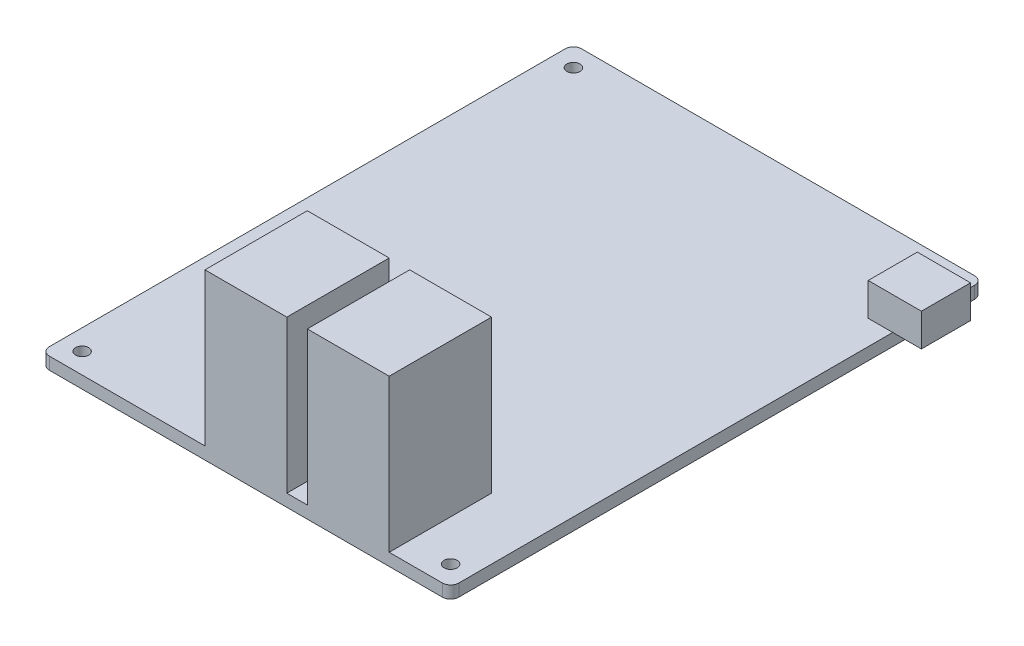
ISO-10303-21;
HEADER;
FILE_DESCRIPTION(('STEP AP214'),'2;1');
FILE_NAME('part.step','',(''),(''),'','','');
FILE_SCHEMA(('AUTOMOTIVE_DESIGN { 1 0 10303 214 1 1 1 1 }'));
ENDSEC;
DATA;
#1=APPLICATION_CONTEXT('core data for automotive mechanical design processes');
#2=APPLICATION_PROTOCOL_DEFINITION('international standard','automotive_design',2000,#1);
#3=PRODUCT_CONTEXT('',#1,'mechanical');
#4=PRODUCT('Part','Part','',(#3));
#5=PRODUCT_RELATED_PRODUCT_CATEGORY('part','',(#4));
#6=PRODUCT_DEFINITION_FORMATION('','',#4);
#7=PRODUCT_DEFINITION_CONTEXT('part definition',#1,'design');
#8=PRODUCT_DEFINITION('design','',#6,#7);
#9=PRODUCT_DEFINITION_SHAPE('','',#8);
#10=(LENGTH_UNIT() NAMED_UNIT(*) SI_UNIT(.MILLI.,.METRE.));
#11=(NAMED_UNIT(*) PLANE_ANGLE_UNIT() SI_UNIT($,.RADIAN.));
#12=(NAMED_UNIT(*) SI_UNIT($,.STERADIAN.) SOLID_ANGLE_UNIT());
#13=UNCERTAINTY_MEASURE_WITH_UNIT(LENGTH_MEASURE(1.E-05),#10,'distance_accuracy_value','');
#14=(GEOMETRIC_REPRESENTATION_CONTEXT(3) GLOBAL_UNCERTAINTY_ASSIGNED_CONTEXT((#13)) GLOBAL_UNIT_ASSIGNED_CONTEXT((#10,
#11,#12)) REPRESENTATION_CONTEXT('',''));
#15=CARTESIAN_POINT('',(0.,0.,0.));
#16=DIRECTION('',(0.,0.,1.));
#17=DIRECTION('',(1.,0.,0.));
#18=AXIS2_PLACEMENT_3D('',#15,#16,#17);
#19=CARTESIAN_POINT('',(0.,3.,0.));
#20=DIRECTION('',(0.,1.,0.));
#21=DIRECTION('',(0.,0.,1.));
#22=AXIS2_PLACEMENT_3D('',#19,#20,#21);
#23=PLANE('',#22);
#24=CARTESIAN_POINT('',(45.,3.,60.));
#25=DIRECTION('',(0.,1.,0.));
#26=DIRECTION('',(0.,0.,-1.));
#27=AXIS2_PLACEMENT_3D('',#24,#25,#26);
#28=CIRCLE('',#27,1.6);
#29=CARTESIAN_POINT('',(45.,3.,58.4));
#30=VERTEX_POINT('',#29);
#31=EDGE_CURVE('E548',#30,#30,#28,.T.);
#32=ORIENTED_EDGE('',*,*,#31,.F.);
#33=EDGE_LOOP('',(#32));
#34=FACE_BOUND('',#33,.T.);
#35=CARTESIAN_POINT('',(45.,3.,-60.));
#36=DIRECTION('',(0.,1.,0.));
#37=DIRECTION('',(0.,0.,1.));
#38=AXIS2_PLACEMENT_3D('',#35,#36,#37);
#39=CIRCLE('',#38,1.6);
#40=CARTESIAN_POINT('',(45.,3.,-58.4));
#41=VERTEX_POINT('',#40);
#42=EDGE_CURVE('E550',#41,#41,#39,.T.);
#43=ORIENTED_EDGE('',*,*,#42,.F.);
#44=EDGE_LOOP('',(#43));
#45=FACE_BOUND('',#44,.T.);
#46=CARTESIAN_POINT('',(-45.,3.,-60.));
#47=DIRECTION('',(0.,1.,0.));
#48=DIRECTION('',(0.,0.,-1.));
#49=AXIS2_PLACEMENT_3D('',#46,#47,#48);
#50=CIRCLE('',#49,1.6);
#51=CARTESIAN_POINT('',(-45.,3.,-61.6));
#52=VERTEX_POINT('',#51);
#53=EDGE_CURVE('E562',#52,#52,#50,.T.);
#54=ORIENTED_EDGE('',*,*,#53,.F.);
#55=EDGE_LOOP('',(#54));
#56=FACE_BOUND('',#55,.T.);
#57=CARTESIAN_POINT('',(-45.,3.,60.));
#58=DIRECTION('',(0.,1.,0.));
#59=DIRECTION('',(0.,0.,1.));
#60=AXIS2_PLACEMENT_3D('',#57,#58,#59);
#61=CIRCLE('',#60,1.6);
#62=CARTESIAN_POINT('',(-45.,3.,61.6));
#63=VERTEX_POINT('',#62);
#64=EDGE_CURVE('E556',#63,#63,#61,.T.);
#65=ORIENTED_EDGE('',*,*,#64,.F.);
#66=EDGE_LOOP('',(#65));
#67=FACE_BOUND('',#66,.T.);
#68=DIRECTION('',(0.,0.,1.));
#69=VECTOR('',#68,1.);
#70=CARTESIAN_POINT('',(44.,3.,-55.));
#71=LINE('',#70,#69);
#72=CARTESIAN_POINT('',(44.,3.,-55.));
#73=VERTEX_POINT('',#72);
#74=CARTESIAN_POINT('',(44.,3.,-43.));
#75=VERTEX_POINT('',#74);
#76=EDGE_CURVE('E50',#73,#75,#71,.T.);
#77=ORIENTED_EDGE('',*,*,#76,.F.);
#78=DIRECTION('',(-1.,0.,0.));
#79=VECTOR('',#78,1.);
#80=CARTESIAN_POINT('',(44.,3.,-55.));
#81=LINE('',#80,#79);
#82=CARTESIAN_POINT('',(50.,3.,-55.));
#83=VERTEX_POINT('',#82);
#84=EDGE_CURVE('E363',#83,#73,#81,.T.);
#85=ORIENTED_EDGE('',*,*,#84,.F.);
#86=DIRECTION('',(0.,0.,-1.));
#87=VECTOR('',#86,1.);
#88=CARTESIAN_POINT('',(50.,3.,65.));
#89=LINE('',#88,#87);
#90=CARTESIAN_POINT('',(50.,3.,-63.));
#91=VERTEX_POINT('',#90);
#92=EDGE_CURVE('E270',#83,#91,#89,.T.);
#93=ORIENTED_EDGE('',*,*,#92,.T.);
#94=CARTESIAN_POINT('',(48.,3.,-63.));
#95=DIRECTION('',(0.,1.,0.));
#96=DIRECTION('',(0.,0.,1.));
#97=AXIS2_PLACEMENT_3D('',#94,#95,#96);
#98=CIRCLE('',#97,2.);
#99=CARTESIAN_POINT('',(48.,3.,-65.));
#100=VERTEX_POINT('',#99);
#101=EDGE_CURVE('E315',#91,#100,#98,.T.);
#102=ORIENTED_EDGE('',*,*,#101,.T.);
#103=DIRECTION('',(1.,0.,0.));
#104=VECTOR('',#103,1.);
#105=CARTESIAN_POINT('',(-50.,3.,-65.));
#106=LINE('',#105,#104);
#107=CARTESIAN_POINT('',(-48.,3.,-65.));
#108=VERTEX_POINT('',#107);
#109=EDGE_CURVE('E275',#108,#100,#106,.T.);
#110=ORIENTED_EDGE('',*,*,#109,.F.);
#111=CARTESIAN_POINT('',(-48.,3.,-63.));
#112=DIRECTION('',(0.,1.,0.));
#113=DIRECTION('',(0.,0.,1.));
#114=AXIS2_PLACEMENT_3D('',#111,#112,#113);
#115=CIRCLE('',#114,2.);
#116=CARTESIAN_POINT('',(-50.,3.,-63.));
#117=VERTEX_POINT('',#116);
#118=EDGE_CURVE('E317',#108,#117,#115,.T.);
#119=ORIENTED_EDGE('',*,*,#118,.T.);
#120=DIRECTION('',(0.,0.,-1.));
#121=VECTOR('',#120,1.);
#122=CARTESIAN_POINT('',(-50.,3.,65.));
#123=LINE('',#122,#121);
#124=CARTESIAN_POINT('',(-50.,3.,63.));
#125=VERTEX_POINT('',#124);
#126=EDGE_CURVE('E279',#125,#117,#123,.T.);
#127=ORIENTED_EDGE('',*,*,#126,.F.);
#128=CARTESIAN_POINT('',(-48.,3.,63.));
#129=DIRECTION('',(0.,1.,0.));
#130=DIRECTION('',(0.,0.,1.));
#131=AXIS2_PLACEMENT_3D('',#128,#129,#130);
#132=CIRCLE('',#131,2.);
#133=CARTESIAN_POINT('',(-48.,3.,65.));
#134=VERTEX_POINT('',#133);
#135=EDGE_CURVE('E311',#125,#134,#132,.T.);
#136=ORIENTED_EDGE('',*,*,#135,.T.);
#137=DIRECTION('',(1.,0.,0.));
#138=VECTOR('',#137,1.);
#139=CARTESIAN_POINT('',(-50.,3.,65.));
#140=LINE('',#139,#138);
#141=CARTESIAN_POINT('',(-9.99999999999999,3.,65.));
#142=VERTEX_POINT('',#141);
#143=EDGE_CURVE('E268',#134,#142,#140,.T.);
#144=ORIENTED_EDGE('',*,*,#143,.T.);
#145=DIRECTION('',(0.,0.,1.));
#146=VECTOR('',#145,1.);
#147=CARTESIAN_POINT('',(-10.,3.,40.));
#148=LINE('',#147,#146);
#149=CARTESIAN_POINT('',(-10.,3.,40.));
#150=VERTEX_POINT('',#149);
#151=EDGE_CURVE('E242',#150,#142,#148,.T.);
#152=ORIENTED_EDGE('',*,*,#151,.F.);
#153=DIRECTION('',(-1.,0.,0.));
#154=VECTOR('',#153,1.);
#155=CARTESIAN_POINT('',(-10.,3.,40.));
#156=LINE('',#155,#154);
#157=CARTESIAN_POINT('',(10.,3.,40.));
#158=VERTEX_POINT('',#157);
#159=EDGE_CURVE('E251',#158,#150,#156,.T.);
#160=ORIENTED_EDGE('',*,*,#159,.F.);
#161=DIRECTION('',(0.,0.,-1.));
#162=VECTOR('',#161,1.);
#163=CARTESIAN_POINT('',(10.,3.,40.));
#164=LINE('',#163,#162);
#165=CARTESIAN_POINT('',(10.,3.,65.));
#166=VERTEX_POINT('',#165);
#167=EDGE_CURVE('E237',#166,#158,#164,.T.);
#168=ORIENTED_EDGE('',*,*,#167,.F.);
#169=CARTESIAN_POINT('',(15.,3.,65.));
#170=VERTEX_POINT('',#169);
#171=EDGE_CURVE('E271',#166,#170,#140,.T.);
#172=ORIENTED_EDGE('',*,*,#171,.T.);
#173=DIRECTION('',(0.,0.,1.));
#174=VECTOR('',#173,1.);
#175=CARTESIAN_POINT('',(15.,3.,40.));
#176=LINE('',#175,#174);
#177=CARTESIAN_POINT('',(15.,3.,40.));
#178=VERTEX_POINT('',#177);
#179=EDGE_CURVE('E215',#178,#170,#176,.T.);
#180=ORIENTED_EDGE('',*,*,#179,.F.);
#181=DIRECTION('',(-1.,0.,0.));
#182=VECTOR('',#181,1.);
#183=CARTESIAN_POINT('',(15.,3.,40.));
#184=LINE('',#183,#182);
#185=CARTESIAN_POINT('',(35.,3.,40.));
#186=VERTEX_POINT('',#185);
#187=EDGE_CURVE('E205',#186,#178,#184,.T.);
#188=ORIENTED_EDGE('',*,*,#187,.F.);
#189=DIRECTION('',(0.,0.,-1.));
#190=VECTOR('',#189,1.);
#191=CARTESIAN_POINT('',(35.,3.,40.));
#192=LINE('',#191,#190);
#193=CARTESIAN_POINT('',(35.,3.,65.));
#194=VERTEX_POINT('',#193);
#195=EDGE_CURVE('E202',#194,#186,#192,.T.);
#196=ORIENTED_EDGE('',*,*,#195,.F.);
#197=CARTESIAN_POINT('',(48.,3.,65.));
#198=VERTEX_POINT('',#197);
#199=EDGE_CURVE('E272',#194,#198,#140,.T.);
#200=ORIENTED_EDGE('',*,*,#199,.T.);
#201=CARTESIAN_POINT('',(48.,3.,63.));
#202=DIRECTION('',(0.,1.,0.));
#203=DIRECTION('',(0.,0.,1.));
#204=AXIS2_PLACEMENT_3D('',#201,#202,#203);
#205=CIRCLE('',#204,2.);
#206=CARTESIAN_POINT('',(50.,3.,63.));
#207=VERTEX_POINT('',#206);
#208=EDGE_CURVE('E313',#198,#207,#205,.T.);
#209=ORIENTED_EDGE('',*,*,#208,.T.);
#210=CARTESIAN_POINT('',(50.,3.,-43.));
#211=VERTEX_POINT('',#210);
#212=EDGE_CURVE('E273',#207,#211,#89,.T.);
#213=ORIENTED_EDGE('',*,*,#212,.T.);
#214=DIRECTION('',(1.,0.,0.));
#215=VECTOR('',#214,1.);
#216=CARTESIAN_POINT('',(44.,3.,-43.));
#217=LINE('',#216,#215);
#218=EDGE_CURVE('E55',#75,#211,#217,.T.);
#219=ORIENTED_EDGE('',*,*,#218,.F.);
#220=EDGE_LOOP('',(#77,#85,#93,#102,#110,#119,#127,#136,#144,#152,#160,#168,#172,#180,#188,#196,
#200,#209,#213,#219));
#221=FACE_BOUND('',#220,.T.);
#222=ADVANCED_FACE('F35',(#34,#45,#56,#67,#221),#23,.T.);
#223=CARTESIAN_POINT('',(-50.,3.,65.));
#224=DIRECTION('',(0.,0.,-1.));
#225=DIRECTION('',(-1.,0.,0.));
#226=AXIS2_PLACEMENT_3D('',#223,#224,#225);
#227=PLANE('',#226);
#228=DIRECTION('',(1.,0.,0.));
#229=VECTOR('',#228,1.);
#230=CARTESIAN_POINT('',(-50.,0.,65.));
#231=LINE('',#230,#229);
#232=CARTESIAN_POINT('',(-48.,0.,65.));
#233=VERTEX_POINT('',#232);
#234=CARTESIAN_POINT('',(48.,0.,65.));
#235=VERTEX_POINT('',#234);
#236=EDGE_CURVE('E267',#233,#235,#231,.T.);
#237=ORIENTED_EDGE('',*,*,#236,.T.);
#238=DIRECTION('',(0.,-1.,0.));
#239=VECTOR('',#238,1.);
#240=CARTESIAN_POINT('',(48.,3.,65.));
#241=LINE('',#240,#239);
#242=EDGE_CURVE('E11',#235,#198,#241,.F.);
#243=ORIENTED_EDGE('',*,*,#242,.T.);
#244=ORIENTED_EDGE('',*,*,#199,.F.);
#245=DIRECTION('',(0.,-1.,0.));
#246=VECTOR('',#245,1.);
#247=CARTESIAN_POINT('',(35.,40.25,65.));
#248=LINE('',#247,#246);
#249=CARTESIAN_POINT('',(35.,40.25,65.));
#250=VERTEX_POINT('',#249);
#251=EDGE_CURVE('E220',#250,#194,#248,.T.);
#252=ORIENTED_EDGE('',*,*,#251,.F.);
#253=DIRECTION('',(1.,0.,0.));
#254=VECTOR('',#253,1.);
#255=CARTESIAN_POINT('',(15.,40.25,65.));
#256=LINE('',#255,#254);
#257=CARTESIAN_POINT('',(15.,40.25,65.));
#258=VERTEX_POINT('',#257);
#259=EDGE_CURVE('E219',#258,#250,#256,.T.);
#260=ORIENTED_EDGE('',*,*,#259,.F.);
#261=DIRECTION('',(0.,-1.,0.));
#262=VECTOR('',#261,1.);
#263=CARTESIAN_POINT('',(15.,40.25,65.));
#264=LINE('',#263,#262);
#265=EDGE_CURVE('E228',#258,#170,#264,.T.);
#266=ORIENTED_EDGE('',*,*,#265,.T.);
#267=ORIENTED_EDGE('',*,*,#171,.F.);
#268=DIRECTION('',(0.,-1.,0.));
#269=VECTOR('',#268,1.);
#270=CARTESIAN_POINT('',(10.,40.25,65.));
#271=LINE('',#270,#269);
#272=CARTESIAN_POINT('',(10.,40.25,65.));
#273=VERTEX_POINT('',#272);
#274=EDGE_CURVE('E248',#273,#166,#271,.T.);
#275=ORIENTED_EDGE('',*,*,#274,.F.);
#276=DIRECTION('',(1.,0.,0.));
#277=VECTOR('',#276,1.);
#278=CARTESIAN_POINT('',(-10.,40.25,65.));
#279=LINE('',#278,#277);
#280=CARTESIAN_POINT('',(-10.,40.25,65.));
#281=VERTEX_POINT('',#280);
#282=EDGE_CURVE('E246',#281,#273,#279,.T.);
#283=ORIENTED_EDGE('',*,*,#282,.F.);
#284=DIRECTION('',(0.,-1.,0.));
#285=VECTOR('',#284,1.);
#286=CARTESIAN_POINT('',(-10.,40.25,65.));
#287=LINE('',#286,#285);
#288=EDGE_CURVE('E258',#281,#142,#287,.T.);
#289=ORIENTED_EDGE('',*,*,#288,.T.);
#290=ORIENTED_EDGE('',*,*,#143,.F.);
#291=DIRECTION('',(0.,-1.,0.));
#292=VECTOR('',#291,1.);
#293=CARTESIAN_POINT('',(-48.,0.,65.));
#294=LINE('',#293,#292);
#295=EDGE_CURVE('E43',#134,#233,#294,.T.);
#296=ORIENTED_EDGE('',*,*,#295,.T.);
#297=EDGE_LOOP('',(#237,#243,#244,#252,#260,#266,#267,#275,#283,#289,#290,#296));
#298=FACE_BOUND('',#297,.T.);
#299=ADVANCED_FACE('F329',(#298),#227,.F.);
#300=CARTESIAN_POINT('',(50.,3.,65.));
#301=DIRECTION('',(-1.,0.,0.));
#302=DIRECTION('',(0.,0.,1.));
#303=AXIS2_PLACEMENT_3D('',#300,#301,#302);
#304=PLANE('',#303);
#305=DIRECTION('',(0.,0.,-1.));
#306=VECTOR('',#305,1.);
#307=CARTESIAN_POINT('',(50.,0.,65.));
#308=LINE('',#307,#306);
#309=CARTESIAN_POINT('',(50.,0.,63.));
#310=VERTEX_POINT('',#309);
#311=CARTESIAN_POINT('',(50.,0.,-63.));
#312=VERTEX_POINT('',#311);
#313=EDGE_CURVE('E285',#310,#312,#308,.T.);
#314=ORIENTED_EDGE('',*,*,#313,.T.);
#315=DIRECTION('',(0.,-1.,0.));
#316=VECTOR('',#315,1.);
#317=CARTESIAN_POINT('',(50.,3.,-63.));
#318=LINE('',#317,#316);
#319=EDGE_CURVE('E322',#312,#91,#318,.F.);
#320=ORIENTED_EDGE('',*,*,#319,.T.);
#321=ORIENTED_EDGE('',*,*,#92,.F.);
#322=EDGE_CURVE('E276',#211,#83,#89,.T.);
#323=ORIENTED_EDGE('',*,*,#322,.F.);
#324=ORIENTED_EDGE('',*,*,#212,.F.);
#325=DIRECTION('',(0.,-1.,0.));
#326=VECTOR('',#325,1.);
#327=CARTESIAN_POINT('',(50.,3.,63.));
#328=LINE('',#327,#326);
#329=EDGE_CURVE('E319',#207,#310,#328,.T.);
#330=ORIENTED_EDGE('',*,*,#329,.T.);
#331=EDGE_LOOP('',(#314,#320,#321,#323,#324,#330));
#332=FACE_BOUND('',#331,.T.);
#333=ADVANCED_FACE('F343',(#332),#304,.F.);
#334=CARTESIAN_POINT('',(-50.,3.,-65.));
#335=DIRECTION('',(0.,0.,-1.));
#336=DIRECTION('',(-1.,0.,0.));
#337=AXIS2_PLACEMENT_3D('',#334,#335,#336);
#338=PLANE('',#337);
#339=DIRECTION('',(1.,0.,0.));
#340=VECTOR('',#339,1.);
#341=CARTESIAN_POINT('',(-50.,0.,-65.));
#342=LINE('',#341,#340);
#343=CARTESIAN_POINT('',(-48.,0.,-65.));
#344=VERTEX_POINT('',#343);
#345=CARTESIAN_POINT('',(48.,0.,-65.));
#346=VERTEX_POINT('',#345);
#347=EDGE_CURVE('E288',#344,#346,#342,.T.);
#348=ORIENTED_EDGE('',*,*,#347,.F.);
#349=DIRECTION('',(0.,-1.,0.));
#350=VECTOR('',#349,1.);
#351=CARTESIAN_POINT('',(-48.,3.,-65.));
#352=LINE('',#351,#350);
#353=EDGE_CURVE('E309',#344,#108,#352,.F.);
#354=ORIENTED_EDGE('',*,*,#353,.T.);
#355=ORIENTED_EDGE('',*,*,#109,.T.);
#356=DIRECTION('',(0.,-1.,0.));
#357=VECTOR('',#356,1.);
#358=CARTESIAN_POINT('',(48.,0.,-65.));
#359=LINE('',#358,#357);
#360=EDGE_CURVE('E306',#100,#346,#359,.T.);
#361=ORIENTED_EDGE('',*,*,#360,.T.);
#362=EDGE_LOOP('',(#348,#354,#355,#361));
#363=FACE_BOUND('',#362,.T.);
#364=ADVANCED_FACE('F396',(#363),#338,.T.);
#365=CARTESIAN_POINT('',(-50.,3.,65.));
#366=DIRECTION('',(-1.,0.,0.));
#367=DIRECTION('',(0.,0.,1.));
#368=AXIS2_PLACEMENT_3D('',#365,#366,#367);
#369=PLANE('',#368);
#370=ORIENTED_EDGE('',*,*,#126,.T.);
#371=DIRECTION('',(0.,-1.,0.));
#372=VECTOR('',#371,1.);
#373=CARTESIAN_POINT('',(-50.,3.,-63.));
#374=LINE('',#373,#372);
#375=CARTESIAN_POINT('',(-50.,0.,-63.));
#376=VERTEX_POINT('',#375);
#377=EDGE_CURVE('E295',#117,#376,#374,.T.);
#378=ORIENTED_EDGE('',*,*,#377,.T.);
#379=DIRECTION('',(0.,0.,-1.));
#380=VECTOR('',#379,1.);
#381=CARTESIAN_POINT('',(-50.,0.,65.));
#382=LINE('',#381,#380);
#383=CARTESIAN_POINT('',(-50.,0.,63.));
#384=VERTEX_POINT('',#383);
#385=EDGE_CURVE('E291',#384,#376,#382,.T.);
#386=ORIENTED_EDGE('',*,*,#385,.F.);
#387=DIRECTION('',(0.,-1.,0.));
#388=VECTOR('',#387,1.);
#389=CARTESIAN_POINT('',(-50.,3.,63.));
#390=LINE('',#389,#388);
#391=EDGE_CURVE('E282',#384,#125,#390,.F.);
#392=ORIENTED_EDGE('',*,*,#391,.T.);
#393=EDGE_LOOP('',(#370,#378,#386,#392));
#394=FACE_BOUND('',#393,.T.);
#395=ADVANCED_FACE('F392',(#394),#369,.T.);
#396=CARTESIAN_POINT('',(0.,0.,0.));
#397=DIRECTION('',(0.,1.,0.));
#398=DIRECTION('',(0.,0.,1.));
#399=AXIS2_PLACEMENT_3D('',#396,#397,#398);
#400=PLANE('',#399);
#401=CARTESIAN_POINT('',(45.,0.,60.));
#402=DIRECTION('',(0.,1.,0.));
#403=DIRECTION('',(0.,0.,-1.));
#404=AXIS2_PLACEMENT_3D('',#401,#402,#403);
#405=CIRCLE('',#404,1.6);
#406=CARTESIAN_POINT('',(45.,0.,58.4));
#407=VERTEX_POINT('',#406);
#408=EDGE_CURVE('E546',#407,#407,#405,.T.);
#409=ORIENTED_EDGE('',*,*,#408,.T.);
#410=EDGE_LOOP('',(#409));
#411=FACE_BOUND('',#410,.T.);
#412=CARTESIAN_POINT('',(45.,0.,-60.));
#413=DIRECTION('',(0.,1.,0.));
#414=DIRECTION('',(0.,0.,1.));
#415=AXIS2_PLACEMENT_3D('',#412,#413,#414);
#416=CIRCLE('',#415,1.6);
#417=CARTESIAN_POINT('',(45.,0.,-58.4));
#418=VERTEX_POINT('',#417);
#419=EDGE_CURVE('E567',#418,#418,#416,.T.);
#420=ORIENTED_EDGE('',*,*,#419,.T.);
#421=EDGE_LOOP('',(#420));
#422=FACE_BOUND('',#421,.T.);
#423=CARTESIAN_POINT('',(-45.,0.,-60.));
#424=DIRECTION('',(0.,1.,0.));
#425=DIRECTION('',(0.,0.,-1.));
#426=AXIS2_PLACEMENT_3D('',#423,#424,#425);
#427=CIRCLE('',#426,1.6);
#428=CARTESIAN_POINT('',(-45.,0.,-61.6));
#429=VERTEX_POINT('',#428);
#430=EDGE_CURVE('E558',#429,#429,#427,.T.);
#431=ORIENTED_EDGE('',*,*,#430,.T.);
#432=EDGE_LOOP('',(#431));
#433=FACE_BOUND('',#432,.T.);
#434=CARTESIAN_POINT('',(-45.,0.,60.));
#435=DIRECTION('',(0.,1.,0.));
#436=DIRECTION('',(0.,0.,1.));
#437=AXIS2_PLACEMENT_3D('',#434,#435,#436);
#438=CIRCLE('',#437,1.6);
#439=CARTESIAN_POINT('',(-45.,0.,61.6));
#440=VERTEX_POINT('',#439);
#441=EDGE_CURVE('E364',#440,#440,#438,.T.);
#442=ORIENTED_EDGE('',*,*,#441,.T.);
#443=EDGE_LOOP('',(#442));
#444=FACE_BOUND('',#443,.T.);
#445=ORIENTED_EDGE('',*,*,#385,.T.);
#446=CARTESIAN_POINT('',(-48.,0.,-63.));
#447=DIRECTION('',(0.,1.,0.));
#448=DIRECTION('',(0.,0.,1.));
#449=AXIS2_PLACEMENT_3D('',#446,#447,#448);
#450=CIRCLE('',#449,2.);
#451=EDGE_CURVE('E304',#376,#344,#450,.F.);
#452=ORIENTED_EDGE('',*,*,#451,.T.);
#453=ORIENTED_EDGE('',*,*,#347,.T.);
#454=CARTESIAN_POINT('',(48.,0.,-63.));
#455=DIRECTION('',(0.,1.,0.));
#456=DIRECTION('',(0.,0.,1.));
#457=AXIS2_PLACEMENT_3D('',#454,#455,#456);
#458=CIRCLE('',#457,2.);
#459=EDGE_CURVE('E302',#346,#312,#458,.F.);
#460=ORIENTED_EDGE('',*,*,#459,.T.);
#461=ORIENTED_EDGE('',*,*,#313,.F.);
#462=CARTESIAN_POINT('',(48.,0.,63.));
#463=DIRECTION('',(0.,1.,0.));
#464=DIRECTION('',(0.,0.,1.));
#465=AXIS2_PLACEMENT_3D('',#462,#463,#464);
#466=CIRCLE('',#465,2.);
#467=EDGE_CURVE('E300',#310,#235,#466,.F.);
#468=ORIENTED_EDGE('',*,*,#467,.T.);
#469=ORIENTED_EDGE('',*,*,#236,.F.);
#470=CARTESIAN_POINT('',(-48.,0.,63.));
#471=DIRECTION('',(0.,1.,0.));
#472=DIRECTION('',(0.,0.,1.));
#473=AXIS2_PLACEMENT_3D('',#470,#471,#472);
#474=CIRCLE('',#473,2.);
#475=EDGE_CURVE('E298',#233,#384,#474,.F.);
#476=ORIENTED_EDGE('',*,*,#475,.T.);
#477=EDGE_LOOP('',(#445,#452,#453,#460,#461,#468,#469,#476));
#478=FACE_BOUND('',#477,.T.);
#479=ADVANCED_FACE('F334',(#411,#422,#433,#444,#478),#400,.F.);
#480=CARTESIAN_POINT('',(10.,40.25,40.));
#481=DIRECTION('',(-1.,0.,0.));
#482=DIRECTION('',(0.,0.,1.));
#483=AXIS2_PLACEMENT_3D('',#480,#481,#482);
#484=PLANE('',#483);
#485=ORIENTED_EDGE('',*,*,#167,.T.);
#486=DIRECTION('',(0.,-1.,0.));
#487=VECTOR('',#486,1.);
#488=CARTESIAN_POINT('',(10.,40.25,40.));
#489=LINE('',#488,#487);
#490=CARTESIAN_POINT('',(10.,40.25,40.));
#491=VERTEX_POINT('',#490);
#492=EDGE_CURVE('E264',#491,#158,#489,.T.);
#493=ORIENTED_EDGE('',*,*,#492,.F.);
#494=DIRECTION('',(0.,0.,-1.));
#495=VECTOR('',#494,1.);
#496=CARTESIAN_POINT('',(10.,40.25,40.));
#497=LINE('',#496,#495);
#498=EDGE_CURVE('E238',#273,#491,#497,.T.);
#499=ORIENTED_EDGE('',*,*,#498,.F.);
#500=ORIENTED_EDGE('',*,*,#274,.T.);
#501=EDGE_LOOP('',(#485,#493,#499,#500));
#502=FACE_BOUND('',#501,.T.);
#503=ADVANCED_FACE('F389',(#502),#484,.F.);
#504=CARTESIAN_POINT('',(-10.,40.25,40.));
#505=DIRECTION('',(0.,0.,1.));
#506=DIRECTION('',(1.,0.,0.));
#507=AXIS2_PLACEMENT_3D('',#504,#505,#506);
#508=PLANE('',#507);
#509=ORIENTED_EDGE('',*,*,#159,.T.);
#510=DIRECTION('',(0.,-1.,0.));
#511=VECTOR('',#510,1.);
#512=CARTESIAN_POINT('',(-10.,40.25,40.));
#513=LINE('',#512,#511);
#514=CARTESIAN_POINT('',(-10.,40.25,40.));
#515=VERTEX_POINT('',#514);
#516=EDGE_CURVE('E261',#515,#150,#513,.T.);
#517=ORIENTED_EDGE('',*,*,#516,.F.);
#518=DIRECTION('',(-1.,0.,0.));
#519=VECTOR('',#518,1.);
#520=CARTESIAN_POINT('',(-10.,40.25,40.));
#521=LINE('',#520,#519);
#522=EDGE_CURVE('E241',#491,#515,#521,.T.);
#523=ORIENTED_EDGE('',*,*,#522,.F.);
#524=ORIENTED_EDGE('',*,*,#492,.T.);
#525=EDGE_LOOP('',(#509,#517,#523,#524));
#526=FACE_BOUND('',#525,.T.);
#527=ADVANCED_FACE('F442',(#526),#508,.F.);
#528=CARTESIAN_POINT('',(-10.,40.25,40.));
#529=DIRECTION('',(1.,0.,0.));
#530=DIRECTION('',(0.,0.,-1.));
#531=AXIS2_PLACEMENT_3D('',#528,#529,#530);
#532=PLANE('',#531);
#533=ORIENTED_EDGE('',*,*,#151,.T.);
#534=ORIENTED_EDGE('',*,*,#288,.F.);
#535=DIRECTION('',(0.,0.,1.));
#536=VECTOR('',#535,1.);
#537=CARTESIAN_POINT('',(-10.,40.25,40.));
#538=LINE('',#537,#536);
#539=EDGE_CURVE('E244',#515,#281,#538,.T.);
#540=ORIENTED_EDGE('',*,*,#539,.F.);
#541=ORIENTED_EDGE('',*,*,#516,.T.);
#542=EDGE_LOOP('',(#533,#534,#540,#541));
#543=FACE_BOUND('',#542,.T.);
#544=ADVANCED_FACE('F431',(#543),#532,.F.);
#545=CARTESIAN_POINT('',(0.,40.25,0.));
#546=DIRECTION('',(0.,1.,0.));
#547=DIRECTION('',(0.,0.,1.));
#548=AXIS2_PLACEMENT_3D('',#545,#546,#547);
#549=PLANE('',#548);
#550=ORIENTED_EDGE('',*,*,#498,.T.);
#551=ORIENTED_EDGE('',*,*,#522,.T.);
#552=ORIENTED_EDGE('',*,*,#539,.T.);
#553=ORIENTED_EDGE('',*,*,#282,.T.);
#554=EDGE_LOOP('',(#550,#551,#552,#553));
#555=FACE_BOUND('',#554,.T.);
#556=ADVANCED_FACE('F439',(#555),#549,.T.);
#557=CARTESIAN_POINT('',(35.,40.25,40.));
#558=DIRECTION('',(-1.,0.,0.));
#559=DIRECTION('',(0.,0.,1.));
#560=AXIS2_PLACEMENT_3D('',#557,#558,#559);
#561=PLANE('',#560);
#562=ORIENTED_EDGE('',*,*,#195,.T.);
#563=DIRECTION('',(0.,-1.,0.));
#564=VECTOR('',#563,1.);
#565=CARTESIAN_POINT('',(35.,40.25,40.));
#566=LINE('',#565,#564);
#567=CARTESIAN_POINT('',(35.,40.25,40.));
#568=VERTEX_POINT('',#567);
#569=EDGE_CURVE('E234',#568,#186,#566,.T.);
#570=ORIENTED_EDGE('',*,*,#569,.F.);
#571=DIRECTION('',(0.,0.,-1.));
#572=VECTOR('',#571,1.);
#573=CARTESIAN_POINT('',(35.,40.25,40.));
#574=LINE('',#573,#572);
#575=EDGE_CURVE('E211',#250,#568,#574,.T.);
#576=ORIENTED_EDGE('',*,*,#575,.F.);
#577=ORIENTED_EDGE('',*,*,#251,.T.);
#578=EDGE_LOOP('',(#562,#570,#576,#577));
#579=FACE_BOUND('',#578,.T.);
#580=ADVANCED_FACE('F458',(#579),#561,.F.);
#581=CARTESIAN_POINT('',(15.,40.25,40.));
#582=DIRECTION('',(0.,0.,1.));
#583=DIRECTION('',(1.,0.,0.));
#584=AXIS2_PLACEMENT_3D('',#581,#582,#583);
#585=PLANE('',#584);
#586=ORIENTED_EDGE('',*,*,#187,.T.);
#587=DIRECTION('',(0.,-1.,0.));
#588=VECTOR('',#587,1.);
#589=CARTESIAN_POINT('',(15.,40.25,40.));
#590=LINE('',#589,#588);
#591=CARTESIAN_POINT('',(15.,40.25,40.));
#592=VERTEX_POINT('',#591);
#593=EDGE_CURVE('E231',#592,#178,#590,.T.);
#594=ORIENTED_EDGE('',*,*,#593,.F.);
#595=DIRECTION('',(-1.,0.,0.));
#596=VECTOR('',#595,1.);
#597=CARTESIAN_POINT('',(15.,40.25,40.));
#598=LINE('',#597,#596);
#599=EDGE_CURVE('E214',#568,#592,#598,.T.);
#600=ORIENTED_EDGE('',*,*,#599,.F.);
#601=ORIENTED_EDGE('',*,*,#569,.T.);
#602=EDGE_LOOP('',(#586,#594,#600,#601));
#603=FACE_BOUND('',#602,.T.);
#604=ADVANCED_FACE('F461',(#603),#585,.F.);
#605=CARTESIAN_POINT('',(15.,40.25,40.));
#606=DIRECTION('',(1.,0.,0.));
#607=DIRECTION('',(0.,0.,-1.));
#608=AXIS2_PLACEMENT_3D('',#605,#606,#607);
#609=PLANE('',#608);
#610=ORIENTED_EDGE('',*,*,#179,.T.);
#611=ORIENTED_EDGE('',*,*,#265,.F.);
#612=DIRECTION('',(0.,0.,1.));
#613=VECTOR('',#612,1.);
#614=CARTESIAN_POINT('',(15.,40.25,40.));
#615=LINE('',#614,#613);
#616=EDGE_CURVE('E217',#592,#258,#615,.T.);
#617=ORIENTED_EDGE('',*,*,#616,.F.);
#618=ORIENTED_EDGE('',*,*,#593,.T.);
#619=EDGE_LOOP('',(#610,#611,#617,#618));
#620=FACE_BOUND('',#619,.T.);
#621=ADVANCED_FACE('F465',(#620),#609,.F.);
#622=CARTESIAN_POINT('',(0.,40.25,0.));
#623=DIRECTION('',(0.,1.,0.));
#624=DIRECTION('',(0.,0.,1.));
#625=AXIS2_PLACEMENT_3D('',#622,#623,#624);
#626=PLANE('',#625);
#627=ORIENTED_EDGE('',*,*,#575,.T.);
#628=ORIENTED_EDGE('',*,*,#599,.T.);
#629=ORIENTED_EDGE('',*,*,#616,.T.);
#630=ORIENTED_EDGE('',*,*,#259,.T.);
#631=EDGE_LOOP('',(#627,#628,#629,#630));
#632=FACE_BOUND('',#631,.T.);
#633=ADVANCED_FACE('F407',(#632),#626,.T.);
#634=CARTESIAN_POINT('',(-48.,3.,-63.));
#635=DIRECTION('',(0.,-1.,0.));
#636=DIRECTION('',(0.,0.,-1.));
#637=AXIS2_PLACEMENT_3D('',#634,#635,#636);
#638=CYLINDRICAL_SURFACE('',#637,2.);
#639=ORIENTED_EDGE('',*,*,#118,.F.);
#640=ORIENTED_EDGE('',*,*,#353,.F.);
#641=ORIENTED_EDGE('',*,*,#451,.F.);
#642=ORIENTED_EDGE('',*,*,#377,.F.);
#643=EDGE_LOOP('',(#639,#640,#641,#642));
#644=FACE_BOUND('',#643,.T.);
#645=ADVANCED_FACE('F403',(#644),#638,.T.);
#646=CARTESIAN_POINT('',(48.,3.,-63.));
#647=DIRECTION('',(0.,1.,0.));
#648=DIRECTION('',(0.,0.,1.));
#649=AXIS2_PLACEMENT_3D('',#646,#647,#648);
#650=CYLINDRICAL_SURFACE('',#649,2.);
#651=ORIENTED_EDGE('',*,*,#101,.F.);
#652=ORIENTED_EDGE('',*,*,#319,.F.);
#653=ORIENTED_EDGE('',*,*,#459,.F.);
#654=ORIENTED_EDGE('',*,*,#360,.F.);
#655=EDGE_LOOP('',(#651,#652,#653,#654));
#656=FACE_BOUND('',#655,.T.);
#657=ADVANCED_FACE('F406',(#656),#650,.T.);
#658=CARTESIAN_POINT('',(48.,3.,63.));
#659=DIRECTION('',(0.,-1.,0.));
#660=DIRECTION('',(0.,0.,-1.));
#661=AXIS2_PLACEMENT_3D('',#658,#659,#660);
#662=CYLINDRICAL_SURFACE('',#661,2.);
#663=ORIENTED_EDGE('',*,*,#208,.F.);
#664=ORIENTED_EDGE('',*,*,#242,.F.);
#665=ORIENTED_EDGE('',*,*,#467,.F.);
#666=ORIENTED_EDGE('',*,*,#329,.F.);
#667=EDGE_LOOP('',(#663,#664,#665,#666));
#668=FACE_BOUND('',#667,.T.);
#669=ADVANCED_FACE('F340',(#668),#662,.T.);
#670=CARTESIAN_POINT('',(-48.,3.,63.));
#671=DIRECTION('',(0.,1.,0.));
#672=DIRECTION('',(0.,0.,1.));
#673=AXIS2_PLACEMENT_3D('',#670,#671,#672);
#674=CYLINDRICAL_SURFACE('',#673,2.);
#675=ORIENTED_EDGE('',*,*,#135,.F.);
#676=ORIENTED_EDGE('',*,*,#391,.F.);
#677=ORIENTED_EDGE('',*,*,#475,.F.);
#678=ORIENTED_EDGE('',*,*,#295,.F.);
#679=EDGE_LOOP('',(#675,#676,#677,#678));
#680=FACE_BOUND('',#679,.T.);
#681=ADVANCED_FACE('F37',(#680),#674,.T.);
#682=CARTESIAN_POINT('',(0.,3.,0.));
#683=DIRECTION('',(0.,1.,0.));
#684=DIRECTION('',(0.,0.,1.));
#685=AXIS2_PLACEMENT_3D('',#682,#683,#684);
#686=PLANE('',#685);
#687=CARTESIAN_POINT('',(57.,3.,-43.));
#688=VERTEX_POINT('',#687);
#689=EDGE_CURVE('E349',#211,#688,#217,.T.);
#690=ORIENTED_EDGE('',*,*,#689,.F.);
#691=ORIENTED_EDGE('',*,*,#322,.T.);
#692=CARTESIAN_POINT('',(57.,3.,-55.));
#693=VERTEX_POINT('',#692);
#694=EDGE_CURVE('E365',#693,#83,#81,.T.);
#695=ORIENTED_EDGE('',*,*,#694,.F.);
#696=DIRECTION('',(0.,0.,-1.));
#697=VECTOR('',#696,1.);
#698=CARTESIAN_POINT('',(57.,3.,-55.));
#699=LINE('',#698,#697);
#700=EDGE_CURVE('E201',#688,#693,#699,.T.);
#701=ORIENTED_EDGE('',*,*,#700,.F.);
#702=EDGE_LOOP('',(#690,#691,#695,#701));
#703=FACE_BOUND('',#702,.T.);
#704=ADVANCED_FACE('F350',(#703),#686,.F.);
#705=CARTESIAN_POINT('',(57.,11.,-55.));
#706=DIRECTION('',(-1.,0.,0.));
#707=DIRECTION('',(0.,0.,1.));
#708=AXIS2_PLACEMENT_3D('',#705,#706,#707);
#709=PLANE('',#708);
#710=ORIENTED_EDGE('',*,*,#700,.T.);
#711=DIRECTION('',(0.,-1.,0.));
#712=VECTOR('',#711,1.);
#713=CARTESIAN_POINT('',(57.,11.,-55.));
#714=LINE('',#713,#712);
#715=CARTESIAN_POINT('',(57.,11.,-55.));
#716=VERTEX_POINT('',#715);
#717=EDGE_CURVE('E182',#716,#693,#714,.T.);
#718=ORIENTED_EDGE('',*,*,#717,.F.);
#719=DIRECTION('',(0.,0.,-1.));
#720=VECTOR('',#719,1.);
#721=CARTESIAN_POINT('',(57.,11.,-55.));
#722=LINE('',#721,#720);
#723=CARTESIAN_POINT('',(57.,11.,-43.));
#724=VERTEX_POINT('',#723);
#725=EDGE_CURVE('E189',#724,#716,#722,.T.);
#726=ORIENTED_EDGE('',*,*,#725,.F.);
#727=DIRECTION('',(0.,-1.,0.));
#728=VECTOR('',#727,1.);
#729=CARTESIAN_POINT('',(57.,11.,-43.));
#730=LINE('',#729,#728);
#731=EDGE_CURVE('E359',#724,#688,#730,.T.);
#732=ORIENTED_EDGE('',*,*,#731,.T.);
#733=EDGE_LOOP('',(#710,#718,#726,#732));
#734=FACE_BOUND('',#733,.T.);
#735=ADVANCED_FACE('F199',(#734),#709,.F.);
#736=CARTESIAN_POINT('',(44.,11.,-55.));
#737=DIRECTION('',(0.,0.,1.));
#738=DIRECTION('',(1.,0.,0.));
#739=AXIS2_PLACEMENT_3D('',#736,#737,#738);
#740=PLANE('',#739);
#741=ORIENTED_EDGE('',*,*,#694,.T.);
#742=ORIENTED_EDGE('',*,*,#84,.T.);
#743=DIRECTION('',(0.,-1.,0.));
#744=VECTOR('',#743,1.);
#745=CARTESIAN_POINT('',(44.,11.,-55.));
#746=LINE('',#745,#744);
#747=CARTESIAN_POINT('',(44.,11.,-55.));
#748=VERTEX_POINT('',#747);
#749=EDGE_CURVE('E185',#748,#73,#746,.T.);
#750=ORIENTED_EDGE('',*,*,#749,.F.);
#751=DIRECTION('',(-1.,0.,0.));
#752=VECTOR('',#751,1.);
#753=CARTESIAN_POINT('',(44.,11.,-55.));
#754=LINE('',#753,#752);
#755=EDGE_CURVE('E177',#716,#748,#754,.T.);
#756=ORIENTED_EDGE('',*,*,#755,.F.);
#757=ORIENTED_EDGE('',*,*,#717,.T.);
#758=EDGE_LOOP('',(#741,#742,#750,#756,#757));
#759=FACE_BOUND('',#758,.T.);
#760=ADVANCED_FACE('F180',(#759),#740,.F.);
#761=CARTESIAN_POINT('',(44.,11.,-55.));
#762=DIRECTION('',(1.,0.,0.));
#763=DIRECTION('',(0.,0.,-1.));
#764=AXIS2_PLACEMENT_3D('',#761,#762,#763);
#765=PLANE('',#764);
#766=ORIENTED_EDGE('',*,*,#76,.T.);
#767=DIRECTION('',(0.,-1.,0.));
#768=VECTOR('',#767,1.);
#769=CARTESIAN_POINT('',(44.,11.,-43.));
#770=LINE('',#769,#768);
#771=CARTESIAN_POINT('',(44.,11.,-43.));
#772=VERTEX_POINT('',#771);
#773=EDGE_CURVE('E207',#772,#75,#770,.T.);
#774=ORIENTED_EDGE('',*,*,#773,.F.);
#775=DIRECTION('',(0.,0.,1.));
#776=VECTOR('',#775,1.);
#777=CARTESIAN_POINT('',(44.,11.,-55.));
#778=LINE('',#777,#776);
#779=EDGE_CURVE('E188',#748,#772,#778,.T.);
#780=ORIENTED_EDGE('',*,*,#779,.F.);
#781=ORIENTED_EDGE('',*,*,#749,.T.);
#782=EDGE_LOOP('',(#766,#774,#780,#781));
#783=FACE_BOUND('',#782,.T.);
#784=ADVANCED_FACE('F367',(#783),#765,.F.);
#785=CARTESIAN_POINT('',(44.,11.,-43.));
#786=DIRECTION('',(0.,0.,-1.));
#787=DIRECTION('',(-1.,0.,0.));
#788=AXIS2_PLACEMENT_3D('',#785,#786,#787);
#789=PLANE('',#788);
#790=ORIENTED_EDGE('',*,*,#218,.T.);
#791=ORIENTED_EDGE('',*,*,#689,.T.);
#792=ORIENTED_EDGE('',*,*,#731,.F.);
#793=DIRECTION('',(1.,0.,0.));
#794=VECTOR('',#793,1.);
#795=CARTESIAN_POINT('',(44.,11.,-43.));
#796=LINE('',#795,#794);
#797=EDGE_CURVE('E194',#772,#724,#796,.T.);
#798=ORIENTED_EDGE('',*,*,#797,.F.);
#799=ORIENTED_EDGE('',*,*,#773,.T.);
#800=EDGE_LOOP('',(#790,#791,#792,#798,#799));
#801=FACE_BOUND('',#800,.T.);
#802=ADVANCED_FACE('F354',(#801),#789,.F.);
#803=CARTESIAN_POINT('',(0.,11.,0.));
#804=DIRECTION('',(0.,1.,0.));
#805=DIRECTION('',(0.,0.,1.));
#806=AXIS2_PLACEMENT_3D('',#803,#804,#805);
#807=PLANE('',#806);
#808=ORIENTED_EDGE('',*,*,#725,.T.);
#809=ORIENTED_EDGE('',*,*,#755,.T.);
#810=ORIENTED_EDGE('',*,*,#779,.T.);
#811=ORIENTED_EDGE('',*,*,#797,.T.);
#812=EDGE_LOOP('',(#808,#809,#810,#811));
#813=FACE_BOUND('',#812,.T.);
#814=ADVANCED_FACE('F192',(#813),#807,.T.);
#815=CARTESIAN_POINT('',(-45.,0.,60.));
#816=DIRECTION('',(0.,1.,0.));
#817=DIRECTION('',(0.,0.,1.));
#818=AXIS2_PLACEMENT_3D('',#815,#816,#817);
#819=CYLINDRICAL_SURFACE('',#818,1.6);
#820=ORIENTED_EDGE('',*,*,#441,.F.);
#821=EDGE_LOOP('',(#820));
#822=FACE_BOUND('',#821,.T.);
#823=ORIENTED_EDGE('',*,*,#64,.T.);
#824=EDGE_LOOP('',(#823));
#825=FACE_BOUND('',#824,.T.);
#826=ADVANCED_FACE('F499',(#822,#825),#819,.F.);
#827=CARTESIAN_POINT('',(-45.,0.,-60.));
#828=DIRECTION('',(0.,1.,0.));
#829=DIRECTION('',(0.,0.,1.));
#830=AXIS2_PLACEMENT_3D('',#827,#828,#829);
#831=CYLINDRICAL_SURFACE('',#830,1.6);
#832=ORIENTED_EDGE('',*,*,#430,.F.);
#833=EDGE_LOOP('',(#832));
#834=FACE_BOUND('',#833,.T.);
#835=ORIENTED_EDGE('',*,*,#53,.T.);
#836=EDGE_LOOP('',(#835));
#837=FACE_BOUND('',#836,.T.);
#838=ADVANCED_FACE('F509',(#834,#837),#831,.F.);
#839=CARTESIAN_POINT('',(45.,0.,-60.));
#840=DIRECTION('',(0.,1.,0.));
#841=DIRECTION('',(0.,0.,1.));
#842=AXIS2_PLACEMENT_3D('',#839,#840,#841);
#843=CYLINDRICAL_SURFACE('',#842,1.6);
#844=ORIENTED_EDGE('',*,*,#419,.F.);
#845=EDGE_LOOP('',(#844));
#846=FACE_BOUND('',#845,.T.);
#847=ORIENTED_EDGE('',*,*,#42,.T.);
#848=EDGE_LOOP('',(#847));
#849=FACE_BOUND('',#848,.T.);
#850=ADVANCED_FACE('F516',(#846,#849),#843,.F.);
#851=CARTESIAN_POINT('',(45.,0.,60.));
#852=DIRECTION('',(0.,1.,0.));
#853=DIRECTION('',(0.,0.,1.));
#854=AXIS2_PLACEMENT_3D('',#851,#852,#853);
#855=CYLINDRICAL_SURFACE('',#854,1.6);
#856=ORIENTED_EDGE('',*,*,#408,.F.);
#857=EDGE_LOOP('',(#856));
#858=FACE_BOUND('',#857,.T.);
#859=ORIENTED_EDGE('',*,*,#31,.T.);
#860=EDGE_LOOP('',(#859));
#861=FACE_BOUND('',#860,.T.);
#862=ADVANCED_FACE('F524',(#858,#861),#855,.F.);
#863=CLOSED_SHELL('',(#222,#299,#333,#364,#395,#479,#503,#527,#544,#556,#580,#604,#621,#633,
#645,#657,#669,#681,#704,#735,#760,#784,#802,#814,#826,#838,#850,#862));
#864=MANIFOLD_SOLID_BREP('B2',#863);
#865=ADVANCED_BREP_SHAPE_REPRESENTATION('',(#18,#864),#14);
#866=SHAPE_DEFINITION_REPRESENTATION(#9,#865);
ENDSEC;
END-ISO-10303-21;
